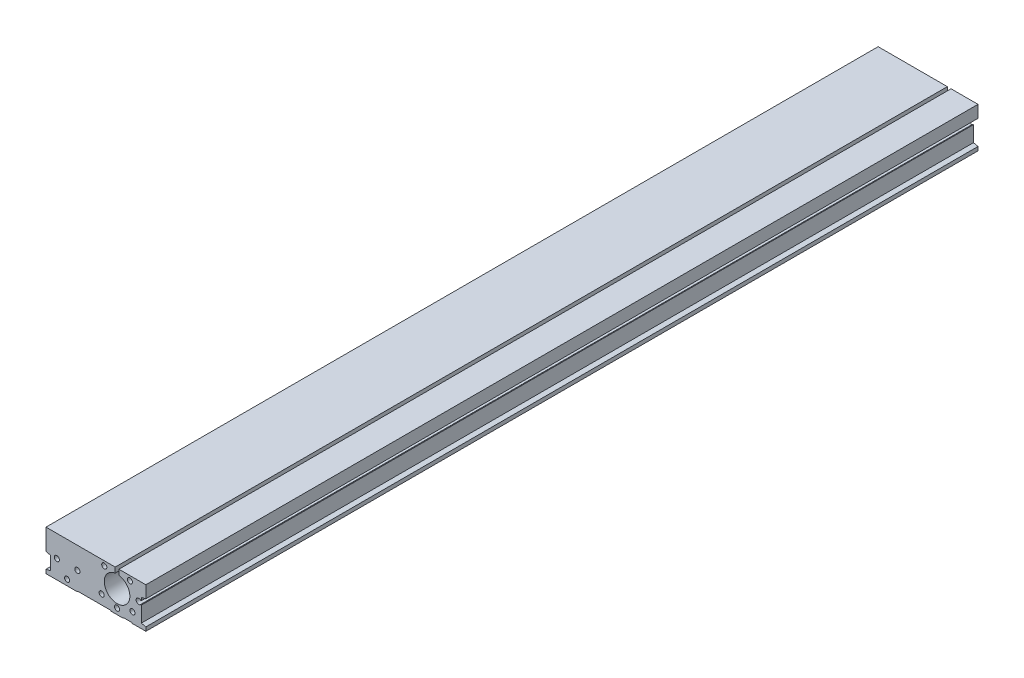
ISO-10303-21;
HEADER;
FILE_DESCRIPTION(('STEP AP214'),'2;1');
FILE_NAME('part.step','',(''),(''),'','','');
FILE_SCHEMA(('AUTOMOTIVE_DESIGN { 1 0 10303 214 1 1 1 1 }'));
ENDSEC;
DATA;
#1=APPLICATION_CONTEXT('core data for automotive mechanical design processes');
#2=APPLICATION_PROTOCOL_DEFINITION('international standard','automotive_design',2000,#1);
#3=PRODUCT_CONTEXT('',#1,'mechanical');
#4=PRODUCT('Part','Part','',(#3));
#5=PRODUCT_RELATED_PRODUCT_CATEGORY('part','',(#4));
#6=PRODUCT_DEFINITION_FORMATION('','',#4);
#7=PRODUCT_DEFINITION_CONTEXT('part definition',#1,'design');
#8=PRODUCT_DEFINITION('design','',#6,#7);
#9=PRODUCT_DEFINITION_SHAPE('','',#8);
#10=(LENGTH_UNIT() NAMED_UNIT(*) SI_UNIT(.MILLI.,.METRE.));
#11=(NAMED_UNIT(*) PLANE_ANGLE_UNIT() SI_UNIT($,.RADIAN.));
#12=(NAMED_UNIT(*) SI_UNIT($,.STERADIAN.) SOLID_ANGLE_UNIT());
#13=UNCERTAINTY_MEASURE_WITH_UNIT(LENGTH_MEASURE(1.E-05),#10,'distance_accuracy_value','');
#14=(GEOMETRIC_REPRESENTATION_CONTEXT(3) GLOBAL_UNCERTAINTY_ASSIGNED_CONTEXT((#13)) GLOBAL_UNIT_ASSIGNED_CONTEXT((#10,
#11,#12)) REPRESENTATION_CONTEXT('',''));
#15=CARTESIAN_POINT('',(0.,0.,0.));
#16=DIRECTION('',(0.,0.,1.));
#17=DIRECTION('',(1.,0.,0.));
#18=AXIS2_PLACEMENT_3D('',#15,#16,#17);
#19=CARTESIAN_POINT('',(-55.5,14.,409.12044935686));
#20=DIRECTION('',(1.,0.,0.));
#21=DIRECTION('',(0.,1.,0.));
#22=AXIS2_PLACEMENT_3D('',#19,#20,#21);
#23=PLANE('',#22);
#24=DIRECTION('',(0.,1.,0.));
#25=VECTOR('',#24,1.);
#26=CARTESIAN_POINT('',(-55.5,14.,-325.));
#27=LINE('',#26,#25);
#28=CARTESIAN_POINT('',(-55.5,-2.50000000000001,-325.));
#29=VERTEX_POINT('',#28);
#30=CARTESIAN_POINT('',(-55.5,14.,-325.));
#31=VERTEX_POINT('',#30);
#32=EDGE_CURVE('E346',#29,#31,#27,.T.);
#33=ORIENTED_EDGE('',*,*,#32,.F.);
#34=DIRECTION('',(0.,0.,1.));
#35=VECTOR('',#34,1.);
#36=CARTESIAN_POINT('',(-55.5,-2.50000000000001,-325.));
#37=LINE('',#36,#35);
#38=CARTESIAN_POINT('',(-55.5,-2.50000000000001,325.));
#39=VERTEX_POINT('',#38);
#40=EDGE_CURVE('E463',#29,#39,#37,.T.);
#41=ORIENTED_EDGE('',*,*,#40,.T.);
#42=DIRECTION('',(0.,-1.,0.));
#43=VECTOR('',#42,1.);
#44=CARTESIAN_POINT('',(-55.5,14.,325.));
#45=LINE('',#44,#43);
#46=CARTESIAN_POINT('',(-55.5,14.,325.));
#47=VERTEX_POINT('',#46);
#48=EDGE_CURVE('E286',#47,#39,#45,.T.);
#49=ORIENTED_EDGE('',*,*,#48,.F.);
#50=DIRECTION('',(0.,0.,-1.));
#51=VECTOR('',#50,1.);
#52=CARTESIAN_POINT('',(-55.5,14.,409.12044935686));
#53=LINE('',#52,#51);
#54=EDGE_CURVE('E260',#47,#31,#53,.T.);
#55=ORIENTED_EDGE('',*,*,#54,.T.);
#56=EDGE_LOOP('',(#33,#41,#49,#55));
#57=FACE_BOUND('',#56,.T.);
#58=ADVANCED_FACE('F36',(#57),#23,.F.);
#59=CARTESIAN_POINT('',(22.5,14.,409.12044935686));
#60=DIRECTION('',(-1.,0.,0.));
#61=DIRECTION('',(0.,-1.,0.));
#62=AXIS2_PLACEMENT_3D('',#59,#60,#61);
#63=PLANE('',#62);
#64=DIRECTION('',(0.,1.,0.));
#65=VECTOR('',#64,1.);
#66=CARTESIAN_POINT('',(22.5,14.,325.));
#67=LINE('',#66,#65);
#68=CARTESIAN_POINT('',(22.5,4.49999999999999,325.));
#69=VERTEX_POINT('',#68);
#70=CARTESIAN_POINT('',(22.5,14.,325.));
#71=VERTEX_POINT('',#70);
#72=EDGE_CURVE('E238',#69,#71,#67,.T.);
#73=ORIENTED_EDGE('',*,*,#72,.F.);
#74=DIRECTION('',(0.,0.,1.));
#75=VECTOR('',#74,1.);
#76=CARTESIAN_POINT('',(22.5,4.49999999999999,-325.));
#77=LINE('',#76,#75);
#78=CARTESIAN_POINT('',(22.5,4.49999999999999,-325.));
#79=VERTEX_POINT('',#78);
#80=EDGE_CURVE('E220',#79,#69,#77,.T.);
#81=ORIENTED_EDGE('',*,*,#80,.F.);
#82=DIRECTION('',(0.,-1.,0.));
#83=VECTOR('',#82,1.);
#84=CARTESIAN_POINT('',(22.5,14.,-325.));
#85=LINE('',#84,#83);
#86=CARTESIAN_POINT('',(22.5,14.,-325.));
#87=VERTEX_POINT('',#86);
#88=EDGE_CURVE('E282',#87,#79,#85,.T.);
#89=ORIENTED_EDGE('',*,*,#88,.F.);
#90=DIRECTION('',(0.,0.,-1.));
#91=VECTOR('',#90,1.);
#92=CARTESIAN_POINT('',(22.5,14.,409.12044935686));
#93=LINE('',#92,#91);
#94=EDGE_CURVE('E44',#71,#87,#93,.T.);
#95=ORIENTED_EDGE('',*,*,#94,.F.);
#96=EDGE_LOOP('',(#73,#81,#89,#95));
#97=FACE_BOUND('',#96,.T.);
#98=ADVANCED_FACE('F244',(#97),#63,.F.);
#99=CARTESIAN_POINT('',(22.5,14.,409.12044935686));
#100=DIRECTION('',(0.,-1.,0.));
#101=DIRECTION('',(1.,0.,0.));
#102=AXIS2_PLACEMENT_3D('',#99,#100,#101);
#103=PLANE('',#102);
#104=DIRECTION('',(1.,0.,0.));
#105=VECTOR('',#104,1.);
#106=CARTESIAN_POINT('',(22.5,14.,-325.));
#107=LINE('',#106,#105);
#108=CARTESIAN_POINT('',(1.45,14.,-325.));
#109=VERTEX_POINT('',#108);
#110=EDGE_CURVE('E279',#109,#87,#107,.T.);
#111=ORIENTED_EDGE('',*,*,#110,.F.);
#112=DIRECTION('',(0.,0.,1.));
#113=VECTOR('',#112,1.);
#114=CARTESIAN_POINT('',(1.45,14.,-325.));
#115=LINE('',#114,#113);
#116=CARTESIAN_POINT('',(1.45,14.,325.));
#117=VERTEX_POINT('',#116);
#118=EDGE_CURVE('E375',#109,#117,#115,.T.);
#119=ORIENTED_EDGE('',*,*,#118,.T.);
#120=DIRECTION('',(-1.,0.,0.));
#121=VECTOR('',#120,1.);
#122=CARTESIAN_POINT('',(22.5,14.,325.));
#123=LINE('',#122,#121);
#124=EDGE_CURVE('E247',#71,#117,#123,.T.);
#125=ORIENTED_EDGE('',*,*,#124,.F.);
#126=ORIENTED_EDGE('',*,*,#94,.T.);
#127=EDGE_LOOP('',(#111,#119,#125,#126));
#128=FACE_BOUND('',#127,.T.);
#129=ADVANCED_FACE('F530',(#128),#103,.F.);
#130=CARTESIAN_POINT('',(22.5,-17.5,409.12044935686));
#131=DIRECTION('',(0.,1.,0.));
#132=DIRECTION('',(-1.,0.,0.));
#133=AXIS2_PLACEMENT_3D('',#130,#131,#132);
#134=PLANE('',#133);
#135=DIRECTION('',(-1.,0.,0.));
#136=VECTOR('',#135,1.);
#137=CARTESIAN_POINT('',(22.5,-17.5,-325.));
#138=LINE('',#137,#136);
#139=CARTESIAN_POINT('',(-31.5,-17.5,-325.));
#140=VERTEX_POINT('',#139);
#141=CARTESIAN_POINT('',(-55.5,-17.5,-325.));
#142=VERTEX_POINT('',#141);
#143=EDGE_CURVE('E309',#140,#142,#138,.T.);
#144=ORIENTED_EDGE('',*,*,#143,.F.);
#145=DIRECTION('',(0.,0.,1.));
#146=VECTOR('',#145,1.);
#147=CARTESIAN_POINT('',(-31.5,-17.5,-325.));
#148=LINE('',#147,#146);
#149=CARTESIAN_POINT('',(-31.5,-17.5,325.));
#150=VERTEX_POINT('',#149);
#151=EDGE_CURVE('E308',#140,#150,#148,.T.);
#152=ORIENTED_EDGE('',*,*,#151,.T.);
#153=DIRECTION('',(1.,0.,0.));
#154=VECTOR('',#153,1.);
#155=CARTESIAN_POINT('',(22.5,-17.5,325.));
#156=LINE('',#155,#154);
#157=CARTESIAN_POINT('',(-55.5,-17.5,325.));
#158=VERTEX_POINT('',#157);
#159=EDGE_CURVE('E273',#158,#150,#156,.T.);
#160=ORIENTED_EDGE('',*,*,#159,.F.);
#161=DIRECTION('',(0.,0.,-1.));
#162=VECTOR('',#161,1.);
#163=CARTESIAN_POINT('',(-55.5,-17.5,409.12044935686));
#164=LINE('',#163,#162);
#165=EDGE_CURVE('E257',#158,#142,#164,.T.);
#166=ORIENTED_EDGE('',*,*,#165,.T.);
#167=EDGE_LOOP('',(#144,#152,#160,#166));
#168=FACE_BOUND('',#167,.T.);
#169=ADVANCED_FACE('F307',(#168),#134,.F.);
#170=CARTESIAN_POINT('',(-4.5,-17.5,325.));
#171=VERTEX_POINT('',#170);
#172=CARTESIAN_POINT('',(4.5,-17.5,325.));
#173=VERTEX_POINT('',#172);
#174=EDGE_CURVE('E271',#171,#173,#156,.T.);
#175=ORIENTED_EDGE('',*,*,#174,.F.);
#176=DIRECTION('',(0.,0.,1.));
#177=VECTOR('',#176,1.);
#178=CARTESIAN_POINT('',(-4.5,-17.5,-325.));
#179=LINE('',#178,#177);
#180=CARTESIAN_POINT('',(-4.5,-17.5,-325.));
#181=VERTEX_POINT('',#180);
#182=EDGE_CURVE('E326',#181,#171,#179,.T.);
#183=ORIENTED_EDGE('',*,*,#182,.F.);
#184=CARTESIAN_POINT('',(4.5,-17.5,-325.));
#185=VERTEX_POINT('',#184);
#186=EDGE_CURVE('E355',#185,#181,#138,.T.);
#187=ORIENTED_EDGE('',*,*,#186,.F.);
#188=DIRECTION('',(0.,0.,1.));
#189=VECTOR('',#188,1.);
#190=CARTESIAN_POINT('',(4.5,-17.5,-325.));
#191=LINE('',#190,#189);
#192=EDGE_CURVE('E343',#185,#173,#191,.T.);
#193=ORIENTED_EDGE('',*,*,#192,.T.);
#194=EDGE_LOOP('',(#175,#183,#187,#193));
#195=FACE_BOUND('',#194,.T.);
#196=ADVANCED_FACE('F575',(#195),#134,.F.);
#197=CARTESIAN_POINT('',(12.,-17.5,325.));
#198=VERTEX_POINT('',#197);
#199=CARTESIAN_POINT('',(22.5,-17.5,325.));
#200=VERTEX_POINT('',#199);
#201=EDGE_CURVE('E265',#198,#200,#156,.T.);
#202=ORIENTED_EDGE('',*,*,#201,.F.);
#203=DIRECTION('',(0.,0.,1.));
#204=VECTOR('',#203,1.);
#205=CARTESIAN_POINT('',(12.,-17.5,-325.));
#206=LINE('',#205,#204);
#207=CARTESIAN_POINT('',(12.,-17.5,-325.));
#208=VERTEX_POINT('',#207);
#209=EDGE_CURVE('E342',#208,#198,#206,.T.);
#210=ORIENTED_EDGE('',*,*,#209,.F.);
#211=CARTESIAN_POINT('',(22.5,-17.5,-325.));
#212=VERTEX_POINT('',#211);
#213=EDGE_CURVE('E352',#212,#208,#138,.T.);
#214=ORIENTED_EDGE('',*,*,#213,.F.);
#215=DIRECTION('',(0.,0.,-1.));
#216=VECTOR('',#215,1.);
#217=CARTESIAN_POINT('',(22.5,-17.5,409.12044935686));
#218=LINE('',#217,#216);
#219=EDGE_CURVE('E250',#200,#212,#218,.T.);
#220=ORIENTED_EDGE('',*,*,#219,.F.);
#221=EDGE_LOOP('',(#202,#210,#214,#220));
#222=FACE_BOUND('',#221,.T.);
#223=ADVANCED_FACE('F570',(#222),#134,.F.);
#224=CARTESIAN_POINT('',(-55.5,-14.5,325.));
#225=VERTEX_POINT('',#224);
#226=EDGE_CURVE('E285',#225,#158,#45,.T.);
#227=ORIENTED_EDGE('',*,*,#226,.F.);
#228=DIRECTION('',(0.,0.,1.));
#229=VECTOR('',#228,1.);
#230=CARTESIAN_POINT('',(-55.5,-14.5,-325.));
#231=LINE('',#230,#229);
#232=CARTESIAN_POINT('',(-55.5,-14.5,-325.));
#233=VERTEX_POINT('',#232);
#234=EDGE_CURVE('E464',#233,#225,#231,.T.);
#235=ORIENTED_EDGE('',*,*,#234,.F.);
#236=EDGE_CURVE('E303',#142,#233,#27,.T.);
#237=ORIENTED_EDGE('',*,*,#236,.F.);
#238=ORIENTED_EDGE('',*,*,#165,.F.);
#239=EDGE_LOOP('',(#227,#235,#237,#238));
#240=FACE_BOUND('',#239,.T.);
#241=ADVANCED_FACE('F301',(#240),#23,.F.);
#242=CARTESIAN_POINT('',(-1.45,14.,325.));
#243=VERTEX_POINT('',#242);
#244=EDGE_CURVE('E251',#243,#47,#123,.T.);
#245=ORIENTED_EDGE('',*,*,#244,.F.);
#246=DIRECTION('',(0.,0.,1.));
#247=VECTOR('',#246,1.);
#248=CARTESIAN_POINT('',(-1.45,14.,-325.));
#249=LINE('',#248,#247);
#250=CARTESIAN_POINT('',(-1.45,14.,-325.));
#251=VERTEX_POINT('',#250);
#252=EDGE_CURVE('E376',#251,#243,#249,.T.);
#253=ORIENTED_EDGE('',*,*,#252,.F.);
#254=EDGE_CURVE('E275',#31,#251,#107,.T.);
#255=ORIENTED_EDGE('',*,*,#254,.F.);
#256=ORIENTED_EDGE('',*,*,#54,.F.);
#257=EDGE_LOOP('',(#245,#253,#255,#256));
#258=FACE_BOUND('',#257,.T.);
#259=ADVANCED_FACE('F542',(#258),#103,.F.);
#260=CARTESIAN_POINT('',(22.5,-14.5,-325.));
#261=VERTEX_POINT('',#260);
#262=EDGE_CURVE('E354',#261,#212,#85,.T.);
#263=ORIENTED_EDGE('',*,*,#262,.F.);
#264=DIRECTION('',(0.,0.,1.));
#265=VECTOR('',#264,1.);
#266=CARTESIAN_POINT('',(22.5,-14.5,-325.));
#267=LINE('',#266,#265);
#268=CARTESIAN_POINT('',(22.5,-14.5,325.));
#269=VERTEX_POINT('',#268);
#270=EDGE_CURVE('E487',#261,#269,#267,.T.);
#271=ORIENTED_EDGE('',*,*,#270,.T.);
#272=EDGE_CURVE('E246',#200,#269,#67,.T.);
#273=ORIENTED_EDGE('',*,*,#272,.F.);
#274=ORIENTED_EDGE('',*,*,#219,.T.);
#275=EDGE_LOOP('',(#263,#271,#273,#274));
#276=FACE_BOUND('',#275,.T.);
#277=ADVANCED_FACE('F38',(#276),#63,.F.);
#278=CARTESIAN_POINT('',(0.,0.,409.12044935686));
#279=DIRECTION('',(0.,0.,-1.));
#280=DIRECTION('',(-1.,0.,0.));
#281=AXIS2_PLACEMENT_3D('',#278,#279,#280);
#282=CYLINDRICAL_SURFACE('',#281,10.);
#283=DIRECTION('',(0.,0.,1.));
#284=VECTOR('',#283,1.);
#285=CARTESIAN_POINT('',(1.45,9.89431655042429,-325.));
#286=LINE('',#285,#284);
#287=CARTESIAN_POINT('',(1.45,9.89431655042429,-325.));
#288=VERTEX_POINT('',#287);
#289=CARTESIAN_POINT('',(1.45,9.89431655042429,325.));
#290=VERTEX_POINT('',#289);
#291=EDGE_CURVE('E381',#288,#290,#286,.T.);
#292=ORIENTED_EDGE('',*,*,#291,.F.);
#293=CARTESIAN_POINT('',(0.,0.,-325.));
#294=DIRECTION('',(0.,0.,1.));
#295=DIRECTION('',(1.,0.,0.));
#296=AXIS2_PLACEMENT_3D('',#293,#294,#295);
#297=CIRCLE('',#296,10.);
#298=CARTESIAN_POINT('',(-1.45,9.89431655042429,-325.));
#299=VERTEX_POINT('',#298);
#300=EDGE_CURVE('E266',#288,#299,#297,.F.);
#301=ORIENTED_EDGE('',*,*,#300,.T.);
#302=DIRECTION('',(0.,0.,1.));
#303=VECTOR('',#302,1.);
#304=CARTESIAN_POINT('',(-1.45,9.89431655042429,-325.));
#305=LINE('',#304,#303);
#306=CARTESIAN_POINT('',(-1.45,9.89431655042429,325.));
#307=VERTEX_POINT('',#306);
#308=EDGE_CURVE('E378',#299,#307,#305,.T.);
#309=ORIENTED_EDGE('',*,*,#308,.T.);
#310=CARTESIAN_POINT('',(0.,0.,325.));
#311=DIRECTION('',(0.,0.,1.));
#312=DIRECTION('',(1.,0.,0.));
#313=AXIS2_PLACEMENT_3D('',#310,#311,#312);
#314=CIRCLE('',#313,10.);
#315=EDGE_CURVE('E263',#307,#290,#314,.T.);
#316=ORIENTED_EDGE('',*,*,#315,.T.);
#317=EDGE_LOOP('',(#292,#301,#309,#316));
#318=FACE_BOUND('',#317,.T.);
#319=ADVANCED_FACE('F535',(#318),#282,.F.);
#320=CARTESIAN_POINT('',(0.,0.,325.));
#321=DIRECTION('',(0.,0.,1.));
#322=DIRECTION('',(1.,0.,0.));
#323=AXIS2_PLACEMENT_3D('',#320,#321,#322);
#324=PLANE('',#323);
#325=DIRECTION('',(0.974370064785237,-0.224951054343859,0.));
#326=VECTOR('',#325,1.);
#327=CARTESIAN_POINT('',(19.,-13.6919613310606,325.));
#328=LINE('',#327,#326);
#329=CARTESIAN_POINT('',(19.,-13.6919613310606,325.));
#330=VERTEX_POINT('',#329);
#331=EDGE_CURVE('E501',#330,#269,#328,.T.);
#332=ORIENTED_EDGE('',*,*,#331,.F.);
#333=DIRECTION('',(0.,-1.,0.));
#334=VECTOR('',#333,1.);
#335=CARTESIAN_POINT('',(19.,3.69196133106052,325.));
#336=LINE('',#335,#334);
#337=CARTESIAN_POINT('',(19.,-1.5,325.));
#338=VERTEX_POINT('',#337);
#339=EDGE_CURVE('E241',#338,#330,#336,.T.);
#340=ORIENTED_EDGE('',*,*,#339,.F.);
#341=DIRECTION('',(1.,0.,0.));
#342=VECTOR('',#341,1.);
#343=CARTESIAN_POINT('',(22.5,-1.5,325.));
#344=LINE('',#343,#342);
#345=CARTESIAN_POINT('',(18.4696938456699,-1.5,325.));
#346=VERTEX_POINT('',#345);
#347=EDGE_CURVE('E457',#346,#338,#344,.T.);
#348=ORIENTED_EDGE('',*,*,#347,.F.);
#349=CARTESIAN_POINT('',(17.,0.,325.));
#350=DIRECTION('',(0.,0.,1.));
#351=DIRECTION('',(1.,0.,0.));
#352=AXIS2_PLACEMENT_3D('',#349,#350,#351);
#353=CIRCLE('',#352,2.1);
#354=CARTESIAN_POINT('',(18.4696938456699,1.5,325.));
#355=VERTEX_POINT('',#354);
#356=EDGE_CURVE('E460',#355,#346,#353,.T.);
#357=ORIENTED_EDGE('',*,*,#356,.F.);
#358=DIRECTION('',(-1.,0.,0.));
#359=VECTOR('',#358,1.);
#360=CARTESIAN_POINT('',(22.5,1.5,325.));
#361=LINE('',#360,#359);
#362=CARTESIAN_POINT('',(19.,1.5,325.));
#363=VERTEX_POINT('',#362);
#364=EDGE_CURVE('E455',#363,#355,#361,.T.);
#365=ORIENTED_EDGE('',*,*,#364,.F.);
#366=CARTESIAN_POINT('',(19.,3.69196133106052,325.));
#367=VERTEX_POINT('',#366);
#368=EDGE_CURVE('E51',#367,#363,#336,.T.);
#369=ORIENTED_EDGE('',*,*,#368,.F.);
#370=DIRECTION('',(-0.974370064785235,-0.224951054343865,0.));
#371=VECTOR('',#370,1.);
#372=CARTESIAN_POINT('',(22.5,4.49999999999999,325.));
#373=LINE('',#372,#371);
#374=EDGE_CURVE('E223',#69,#367,#373,.T.);
#375=ORIENTED_EDGE('',*,*,#374,.F.);
#376=ORIENTED_EDGE('',*,*,#72,.T.);
#377=ORIENTED_EDGE('',*,*,#124,.T.);
#378=DIRECTION('',(0.,1.,0.));
#379=VECTOR('',#378,1.);
#380=CARTESIAN_POINT('',(1.45,9.89431655042429,325.));
#381=LINE('',#380,#379);
#382=EDGE_CURVE('E390',#290,#117,#381,.T.);
#383=ORIENTED_EDGE('',*,*,#382,.F.);
#384=ORIENTED_EDGE('',*,*,#315,.F.);
#385=DIRECTION('',(0.,-1.,0.));
#386=VECTOR('',#385,1.);
#387=CARTESIAN_POINT('',(-1.45,14.,325.));
#388=LINE('',#387,#386);
#389=EDGE_CURVE('E392',#243,#307,#388,.T.);
#390=ORIENTED_EDGE('',*,*,#389,.F.);
#391=ORIENTED_EDGE('',*,*,#244,.T.);
#392=ORIENTED_EDGE('',*,*,#48,.T.);
#393=DIRECTION('',(-0.974370064785235,0.224951054343866,0.));
#394=VECTOR('',#393,1.);
#395=CARTESIAN_POINT('',(-52.,-3.30803866893949,325.));
#396=LINE('',#395,#394);
#397=CARTESIAN_POINT('',(-52.,-3.30803866893949,325.));
#398=VERTEX_POINT('',#397);
#399=EDGE_CURVE('E480',#398,#39,#396,.T.);
#400=ORIENTED_EDGE('',*,*,#399,.F.);
#401=DIRECTION('',(0.,1.,0.));
#402=VECTOR('',#401,1.);
#403=CARTESIAN_POINT('',(-52.,-13.6919613310606,325.));
#404=LINE('',#403,#402);
#405=CARTESIAN_POINT('',(-52.,-13.6919613310606,325.));
#406=VERTEX_POINT('',#405);
#407=EDGE_CURVE('E482',#406,#398,#404,.T.);
#408=ORIENTED_EDGE('',*,*,#407,.F.);
#409=DIRECTION('',(0.974370064785237,0.224951054343858,0.));
#410=VECTOR('',#409,1.);
#411=CARTESIAN_POINT('',(-55.5,-14.5,325.));
#412=LINE('',#411,#410);
#413=EDGE_CURVE('E297',#225,#406,#412,.T.);
#414=ORIENTED_EDGE('',*,*,#413,.F.);
#415=ORIENTED_EDGE('',*,*,#226,.T.);
#416=ORIENTED_EDGE('',*,*,#159,.T.);
#417=DIRECTION('',(-0.866025403784441,-0.499999999999996,0.));
#418=VECTOR('',#417,1.);
#419=CARTESIAN_POINT('',(-30.6339745962156,-17.,325.));
#420=LINE('',#419,#418);
#421=CARTESIAN_POINT('',(-30.6339745962156,-17.,325.));
#422=VERTEX_POINT('',#421);
#423=EDGE_CURVE('E365',#422,#150,#420,.T.);
#424=ORIENTED_EDGE('',*,*,#423,.F.);
#425=DIRECTION('',(-1.,0.,0.));
#426=VECTOR('',#425,1.);
#427=CARTESIAN_POINT('',(-5.36602540378445,-17.,325.));
#428=LINE('',#427,#426);
#429=CARTESIAN_POINT('',(-5.36602540378445,-17.,325.));
#430=VERTEX_POINT('',#429);
#431=EDGE_CURVE('E369',#430,#422,#428,.T.);
#432=ORIENTED_EDGE('',*,*,#431,.F.);
#433=DIRECTION('',(-0.866025403784442,0.499999999999995,0.));
#434=VECTOR('',#433,1.);
#435=CARTESIAN_POINT('',(-4.5,-17.5,325.));
#436=LINE('',#435,#434);
#437=EDGE_CURVE('E372',#171,#430,#436,.T.);
#438=ORIENTED_EDGE('',*,*,#437,.F.);
#439=ORIENTED_EDGE('',*,*,#174,.T.);
#440=DIRECTION('',(-0.866025403784441,-0.499999999999996,0.));
#441=VECTOR('',#440,1.);
#442=CARTESIAN_POINT('',(5.36602540378445,-17.,325.));
#443=LINE('',#442,#441);
#444=CARTESIAN_POINT('',(5.36602540378445,-17.,325.));
#445=VERTEX_POINT('',#444);
#446=EDGE_CURVE('E330',#445,#173,#443,.T.);
#447=ORIENTED_EDGE('',*,*,#446,.F.);
#448=DIRECTION('',(-1.,0.,0.));
#449=VECTOR('',#448,1.);
#450=CARTESIAN_POINT('',(11.1339745962155,-17.,325.));
#451=LINE('',#450,#449);
#452=CARTESIAN_POINT('',(11.1339745962155,-17.,325.));
#453=VERTEX_POINT('',#452);
#454=EDGE_CURVE('E317',#453,#445,#451,.T.);
#455=ORIENTED_EDGE('',*,*,#454,.F.);
#456=DIRECTION('',(-0.866025403784442,0.499999999999995,0.));
#457=VECTOR('',#456,1.);
#458=CARTESIAN_POINT('',(12.,-17.5,325.));
#459=LINE('',#458,#457);
#460=EDGE_CURVE('E313',#198,#453,#459,.T.);
#461=ORIENTED_EDGE('',*,*,#460,.F.);
#462=ORIENTED_EDGE('',*,*,#201,.T.);
#463=ORIENTED_EDGE('',*,*,#272,.T.);
#464=EDGE_LOOP('',(#332,#340,#348,#357,#365,#369,#375,#376,#377,#383,#384,#390,#391,#392,#400,
#408,#414,#415,#416,#424,#432,#438,#439,#447,#455,#461,#462,#463));
#465=FACE_BOUND('',#464,.T.);
#466=CARTESIAN_POINT('',(-39.,-13.,325.));
#467=DIRECTION('',(0.,0.,1.));
#468=DIRECTION('',(1.,0.,0.));
#469=AXIS2_PLACEMENT_3D('',#466,#467,#468);
#470=CIRCLE('',#469,2.);
#471=CARTESIAN_POINT('',(-37.,-13.,325.));
#472=VERTEX_POINT('',#471);
#473=EDGE_CURVE('E423',#472,#472,#470,.T.);
#474=ORIENTED_EDGE('',*,*,#473,.F.);
#475=EDGE_LOOP('',(#474));
#476=FACE_BOUND('',#475,.T.);
#477=CARTESIAN_POINT('',(-47.,-3.00000000000001,325.));
#478=DIRECTION('',(0.,0.,1.));
#479=DIRECTION('',(1.,0.,0.));
#480=AXIS2_PLACEMENT_3D('',#477,#478,#479);
#481=CIRCLE('',#480,2.);
#482=CARTESIAN_POINT('',(-45.,-3.00000000000001,325.));
#483=VERTEX_POINT('',#482);
#484=EDGE_CURVE('E422',#483,#483,#481,.T.);
#485=ORIENTED_EDGE('',*,*,#484,.F.);
#486=EDGE_LOOP('',(#485));
#487=FACE_BOUND('',#486,.T.);
#488=CARTESIAN_POINT('',(-31.,-3.00000000000001,325.));
#489=DIRECTION('',(0.,0.,1.));
#490=DIRECTION('',(1.,0.,0.));
#491=AXIS2_PLACEMENT_3D('',#488,#489,#490);
#492=CIRCLE('',#491,2.);
#493=CARTESIAN_POINT('',(-29.,-3.00000000000001,325.));
#494=VERTEX_POINT('',#493);
#495=EDGE_CURVE('E430',#494,#494,#492,.T.);
#496=ORIENTED_EDGE('',*,*,#495,.F.);
#497=EDGE_LOOP('',(#496));
#498=FACE_BOUND('',#497,.T.);
#499=CARTESIAN_POINT('',(0.,-13.,325.));
#500=DIRECTION('',(0.,0.,1.));
#501=DIRECTION('',(1.,0.,0.));
#502=AXIS2_PLACEMENT_3D('',#499,#500,#501);
#503=CIRCLE('',#502,2.);
#504=CARTESIAN_POINT('',(2.,-13.,325.));
#505=VERTEX_POINT('',#504);
#506=EDGE_CURVE('E436',#505,#505,#503,.T.);
#507=ORIENTED_EDGE('',*,*,#506,.F.);
#508=EDGE_LOOP('',(#507));
#509=FACE_BOUND('',#508,.T.);
#510=CARTESIAN_POINT('',(-10.,10.5,325.));
#511=DIRECTION('',(0.,0.,1.));
#512=DIRECTION('',(-1.,0.,0.));
#513=AXIS2_PLACEMENT_3D('',#510,#511,#512);
#514=CIRCLE('',#513,2.);
#515=CARTESIAN_POINT('',(-12.,10.5,325.));
#516=VERTEX_POINT('',#515);
#517=EDGE_CURVE('E405',#516,#516,#514,.T.);
#518=ORIENTED_EDGE('',*,*,#517,.F.);
#519=EDGE_LOOP('',(#518));
#520=FACE_BOUND('',#519,.T.);
#521=CARTESIAN_POINT('',(10.,10.5,325.));
#522=DIRECTION('',(0.,0.,1.));
#523=DIRECTION('',(1.,0.,0.));
#524=AXIS2_PLACEMENT_3D('',#521,#522,#523);
#525=CIRCLE('',#524,2.);
#526=CARTESIAN_POINT('',(12.,10.5,325.));
#527=VERTEX_POINT('',#526);
#528=EDGE_CURVE('E404',#527,#527,#525,.T.);
#529=ORIENTED_EDGE('',*,*,#528,.F.);
#530=EDGE_LOOP('',(#529));
#531=FACE_BOUND('',#530,.T.);
#532=CARTESIAN_POINT('',(-12.,-9.50000000000001,325.));
#533=DIRECTION('',(0.,0.,1.));
#534=DIRECTION('',(1.,0.,0.));
#535=AXIS2_PLACEMENT_3D('',#532,#533,#534);
#536=CIRCLE('',#535,2.);
#537=CARTESIAN_POINT('',(-9.99999999999999,-9.50000000000001,325.));
#538=VERTEX_POINT('',#537);
#539=EDGE_CURVE('E412',#538,#538,#536,.T.);
#540=ORIENTED_EDGE('',*,*,#539,.F.);
#541=EDGE_LOOP('',(#540));
#542=FACE_BOUND('',#541,.T.);
#543=CARTESIAN_POINT('',(12.,-9.50000000000001,325.));
#544=DIRECTION('',(0.,0.,1.));
#545=DIRECTION('',(1.,0.,0.));
#546=AXIS2_PLACEMENT_3D('',#543,#544,#545);
#547=CIRCLE('',#546,2.);
#548=CARTESIAN_POINT('',(14.,-9.50000000000001,325.));
#549=VERTEX_POINT('',#548);
#550=EDGE_CURVE('E397',#549,#549,#547,.T.);
#551=ORIENTED_EDGE('',*,*,#550,.F.);
#552=EDGE_LOOP('',(#551));
#553=FACE_BOUND('',#552,.T.);
#554=ADVANCED_FACE('F235',(#465,#476,#487,#498,#509,#520,#531,#542,#553),#324,.T.);
#555=CARTESIAN_POINT('',(0.,0.,-325.));
#556=DIRECTION('',(0.,0.,1.));
#557=DIRECTION('',(1.,0.,0.));
#558=AXIS2_PLACEMENT_3D('',#555,#556,#557);
#559=PLANE('',#558);
#560=CARTESIAN_POINT('',(-39.,-13.,-325.));
#561=DIRECTION('',(0.,0.,1.));
#562=DIRECTION('',(1.,0.,0.));
#563=AXIS2_PLACEMENT_3D('',#560,#561,#562);
#564=CIRCLE('',#563,2.);
#565=CARTESIAN_POINT('',(-37.,-13.,-325.));
#566=VERTEX_POINT('',#565);
#567=EDGE_CURVE('E419',#566,#566,#564,.T.);
#568=ORIENTED_EDGE('',*,*,#567,.T.);
#569=EDGE_LOOP('',(#568));
#570=FACE_BOUND('',#569,.T.);
#571=CARTESIAN_POINT('',(-47.,-3.00000000000001,-325.));
#572=DIRECTION('',(0.,0.,1.));
#573=DIRECTION('',(1.,0.,0.));
#574=AXIS2_PLACEMENT_3D('',#571,#572,#573);
#575=CIRCLE('',#574,2.);
#576=CARTESIAN_POINT('',(-45.,-3.00000000000001,-325.));
#577=VERTEX_POINT('',#576);
#578=EDGE_CURVE('E427',#577,#577,#575,.T.);
#579=ORIENTED_EDGE('',*,*,#578,.T.);
#580=EDGE_LOOP('',(#579));
#581=FACE_BOUND('',#580,.T.);
#582=CARTESIAN_POINT('',(-31.,-3.00000000000001,-325.));
#583=DIRECTION('',(0.,0.,1.));
#584=DIRECTION('',(1.,0.,0.));
#585=AXIS2_PLACEMENT_3D('',#582,#583,#584);
#586=CIRCLE('',#585,2.);
#587=CARTESIAN_POINT('',(-29.,-3.00000000000001,-325.));
#588=VERTEX_POINT('',#587);
#589=EDGE_CURVE('E433',#588,#588,#586,.T.);
#590=ORIENTED_EDGE('',*,*,#589,.T.);
#591=EDGE_LOOP('',(#590));
#592=FACE_BOUND('',#591,.T.);
#593=CARTESIAN_POINT('',(0.,-13.,-325.));
#594=DIRECTION('',(0.,0.,1.));
#595=DIRECTION('',(1.,0.,0.));
#596=AXIS2_PLACEMENT_3D('',#593,#594,#595);
#597=CIRCLE('',#596,2.);
#598=CARTESIAN_POINT('',(2.,-13.,-325.));
#599=VERTEX_POINT('',#598);
#600=EDGE_CURVE('E408',#599,#599,#597,.T.);
#601=ORIENTED_EDGE('',*,*,#600,.T.);
#602=EDGE_LOOP('',(#601));
#603=FACE_BOUND('',#602,.T.);
#604=CARTESIAN_POINT('',(-10.,10.5,-325.));
#605=DIRECTION('',(0.,0.,1.));
#606=DIRECTION('',(-1.,0.,0.));
#607=AXIS2_PLACEMENT_3D('',#604,#605,#606);
#608=CIRCLE('',#607,2.);
#609=CARTESIAN_POINT('',(-12.,10.5,-325.));
#610=VERTEX_POINT('',#609);
#611=EDGE_CURVE('E401',#610,#610,#608,.T.);
#612=ORIENTED_EDGE('',*,*,#611,.T.);
#613=EDGE_LOOP('',(#612));
#614=FACE_BOUND('',#613,.T.);
#615=CARTESIAN_POINT('',(10.,10.5,-325.));
#616=DIRECTION('',(0.,0.,1.));
#617=DIRECTION('',(1.,0.,0.));
#618=AXIS2_PLACEMENT_3D('',#615,#616,#617);
#619=CIRCLE('',#618,2.);
#620=CARTESIAN_POINT('',(12.,10.5,-325.));
#621=VERTEX_POINT('',#620);
#622=EDGE_CURVE('E409',#621,#621,#619,.T.);
#623=ORIENTED_EDGE('',*,*,#622,.T.);
#624=EDGE_LOOP('',(#623));
#625=FACE_BOUND('',#624,.T.);
#626=CARTESIAN_POINT('',(-12.,-9.50000000000001,-325.));
#627=DIRECTION('',(0.,0.,1.));
#628=DIRECTION('',(1.,0.,0.));
#629=AXIS2_PLACEMENT_3D('',#626,#627,#628);
#630=CIRCLE('',#629,2.);
#631=CARTESIAN_POINT('',(-9.99999999999999,-9.50000000000001,-325.));
#632=VERTEX_POINT('',#631);
#633=EDGE_CURVE('E400',#632,#632,#630,.T.);
#634=ORIENTED_EDGE('',*,*,#633,.T.);
#635=EDGE_LOOP('',(#634));
#636=FACE_BOUND('',#635,.T.);
#637=CARTESIAN_POINT('',(12.,-9.50000000000001,-325.));
#638=DIRECTION('',(0.,0.,1.));
#639=DIRECTION('',(1.,0.,0.));
#640=AXIS2_PLACEMENT_3D('',#637,#638,#639);
#641=CIRCLE('',#640,2.);
#642=CARTESIAN_POINT('',(14.,-9.50000000000001,-325.));
#643=VERTEX_POINT('',#642);
#644=EDGE_CURVE('E394',#643,#643,#641,.T.);
#645=ORIENTED_EDGE('',*,*,#644,.T.);
#646=EDGE_LOOP('',(#645));
#647=FACE_BOUND('',#646,.T.);
#648=DIRECTION('',(0.,-1.,0.));
#649=VECTOR('',#648,1.);
#650=CARTESIAN_POINT('',(19.,3.69196133106052,-325.));
#651=LINE('',#650,#649);
#652=CARTESIAN_POINT('',(19.,-1.5,-325.));
#653=VERTEX_POINT('',#652);
#654=CARTESIAN_POINT('',(19.,-13.6919613310606,-325.));
#655=VERTEX_POINT('',#654);
#656=EDGE_CURVE('E59',#653,#655,#651,.T.);
#657=ORIENTED_EDGE('',*,*,#656,.T.);
#658=DIRECTION('',(0.974370064785237,-0.224951054343859,0.));
#659=VECTOR('',#658,1.);
#660=CARTESIAN_POINT('',(19.,-13.6919613310606,-325.));
#661=LINE('',#660,#659);
#662=EDGE_CURVE('E231',#655,#261,#661,.T.);
#663=ORIENTED_EDGE('',*,*,#662,.T.);
#664=ORIENTED_EDGE('',*,*,#262,.T.);
#665=ORIENTED_EDGE('',*,*,#213,.T.);
#666=DIRECTION('',(-0.866025403784442,0.499999999999995,0.));
#667=VECTOR('',#666,1.);
#668=CARTESIAN_POINT('',(12.,-17.5,-325.));
#669=LINE('',#668,#667);
#670=CARTESIAN_POINT('',(11.1339745962156,-17.,-325.));
#671=VERTEX_POINT('',#670);
#672=EDGE_CURVE('E333',#208,#671,#669,.T.);
#673=ORIENTED_EDGE('',*,*,#672,.T.);
#674=DIRECTION('',(-1.,0.,0.));
#675=VECTOR('',#674,1.);
#676=CARTESIAN_POINT('',(11.1339745962155,-17.,-325.));
#677=LINE('',#676,#675);
#678=CARTESIAN_POINT('',(5.36602540378445,-17.,-325.));
#679=VERTEX_POINT('',#678);
#680=EDGE_CURVE('E336',#671,#679,#677,.T.);
#681=ORIENTED_EDGE('',*,*,#680,.T.);
#682=DIRECTION('',(-0.866025403784441,-0.499999999999996,0.));
#683=VECTOR('',#682,1.);
#684=CARTESIAN_POINT('',(5.36602540378445,-17.,-325.));
#685=LINE('',#684,#683);
#686=EDGE_CURVE('E339',#679,#185,#685,.T.);
#687=ORIENTED_EDGE('',*,*,#686,.T.);
#688=ORIENTED_EDGE('',*,*,#186,.T.);
#689=DIRECTION('',(-0.866025403784442,0.499999999999995,0.));
#690=VECTOR('',#689,1.);
#691=CARTESIAN_POINT('',(-4.5,-17.5,-325.));
#692=LINE('',#691,#690);
#693=CARTESIAN_POINT('',(-5.36602540378445,-17.,-325.));
#694=VERTEX_POINT('',#693);
#695=EDGE_CURVE('E364',#181,#694,#692,.T.);
#696=ORIENTED_EDGE('',*,*,#695,.T.);
#697=DIRECTION('',(-1.,0.,0.));
#698=VECTOR('',#697,1.);
#699=CARTESIAN_POINT('',(-5.36602540378445,-17.,-325.));
#700=LINE('',#699,#698);
#701=CARTESIAN_POINT('',(-30.6339745962156,-17.,-325.));
#702=VERTEX_POINT('',#701);
#703=EDGE_CURVE('E363',#694,#702,#700,.T.);
#704=ORIENTED_EDGE('',*,*,#703,.T.);
#705=DIRECTION('',(-0.866025403784441,-0.499999999999996,0.));
#706=VECTOR('',#705,1.);
#707=CARTESIAN_POINT('',(-30.6339745962156,-17.,-325.));
#708=LINE('',#707,#706);
#709=EDGE_CURVE('E322',#702,#140,#708,.T.);
#710=ORIENTED_EDGE('',*,*,#709,.T.);
#711=ORIENTED_EDGE('',*,*,#143,.T.);
#712=ORIENTED_EDGE('',*,*,#236,.T.);
#713=DIRECTION('',(0.974370064785237,0.224951054343858,0.));
#714=VECTOR('',#713,1.);
#715=CARTESIAN_POINT('',(-55.5,-14.5,-325.));
#716=LINE('',#715,#714);
#717=CARTESIAN_POINT('',(-52.,-13.6919613310606,-325.));
#718=VERTEX_POINT('',#717);
#719=EDGE_CURVE('E478',#233,#718,#716,.T.);
#720=ORIENTED_EDGE('',*,*,#719,.T.);
#721=DIRECTION('',(0.,1.,0.));
#722=VECTOR('',#721,1.);
#723=CARTESIAN_POINT('',(-52.,-13.6919613310606,-325.));
#724=LINE('',#723,#722);
#725=CARTESIAN_POINT('',(-52.,-3.30803866893949,-325.));
#726=VERTEX_POINT('',#725);
#727=EDGE_CURVE('E475',#718,#726,#724,.T.);
#728=ORIENTED_EDGE('',*,*,#727,.T.);
#729=DIRECTION('',(-0.974370064785235,0.224951054343866,0.));
#730=VECTOR('',#729,1.);
#731=CARTESIAN_POINT('',(-52.,-3.30803866893949,-325.));
#732=LINE('',#731,#730);
#733=EDGE_CURVE('E467',#726,#29,#732,.T.);
#734=ORIENTED_EDGE('',*,*,#733,.T.);
#735=ORIENTED_EDGE('',*,*,#32,.T.);
#736=ORIENTED_EDGE('',*,*,#254,.T.);
#737=DIRECTION('',(0.,-1.,0.));
#738=VECTOR('',#737,1.);
#739=CARTESIAN_POINT('',(-1.45,14.,-325.));
#740=LINE('',#739,#738);
#741=EDGE_CURVE('E387',#251,#299,#740,.T.);
#742=ORIENTED_EDGE('',*,*,#741,.T.);
#743=ORIENTED_EDGE('',*,*,#300,.F.);
#744=DIRECTION('',(0.,1.,0.));
#745=VECTOR('',#744,1.);
#746=CARTESIAN_POINT('',(1.45,9.89431655042429,-325.));
#747=LINE('',#746,#745);
#748=EDGE_CURVE('E379',#288,#109,#747,.T.);
#749=ORIENTED_EDGE('',*,*,#748,.T.);
#750=ORIENTED_EDGE('',*,*,#110,.T.);
#751=ORIENTED_EDGE('',*,*,#88,.T.);
#752=DIRECTION('',(-0.974370064785235,-0.224951054343865,0.));
#753=VECTOR('',#752,1.);
#754=CARTESIAN_POINT('',(22.5,4.49999999999999,-325.));
#755=LINE('',#754,#753);
#756=CARTESIAN_POINT('',(19.,3.69196133106052,-325.));
#757=VERTEX_POINT('',#756);
#758=EDGE_CURVE('E225',#79,#757,#755,.T.);
#759=ORIENTED_EDGE('',*,*,#758,.T.);
#760=CARTESIAN_POINT('',(19.,1.5,-325.));
#761=VERTEX_POINT('',#760);
#762=EDGE_CURVE('E497',#757,#761,#651,.T.);
#763=ORIENTED_EDGE('',*,*,#762,.T.);
#764=DIRECTION('',(-1.,0.,0.));
#765=VECTOR('',#764,1.);
#766=CARTESIAN_POINT('',(22.5,1.5,-325.));
#767=LINE('',#766,#765);
#768=CARTESIAN_POINT('',(18.4696938456699,1.5,-325.));
#769=VERTEX_POINT('',#768);
#770=EDGE_CURVE('E445',#761,#769,#767,.T.);
#771=ORIENTED_EDGE('',*,*,#770,.T.);
#772=CARTESIAN_POINT('',(17.,0.,-325.));
#773=DIRECTION('',(0.,0.,1.));
#774=DIRECTION('',(1.,0.,0.));
#775=AXIS2_PLACEMENT_3D('',#772,#773,#774);
#776=CIRCLE('',#775,2.1);
#777=CARTESIAN_POINT('',(18.4696938456699,-1.5,-325.));
#778=VERTEX_POINT('',#777);
#779=EDGE_CURVE('E452',#769,#778,#776,.T.);
#780=ORIENTED_EDGE('',*,*,#779,.T.);
#781=DIRECTION('',(1.,0.,0.));
#782=VECTOR('',#781,1.);
#783=CARTESIAN_POINT('',(22.5,-1.5,-325.));
#784=LINE('',#783,#782);
#785=EDGE_CURVE('E449',#778,#653,#784,.T.);
#786=ORIENTED_EDGE('',*,*,#785,.T.);
#787=EDGE_LOOP('',(#657,#663,#664,#665,#673,#681,#687,#688,#696,#704,#710,#711,#712,#720,#728,
#734,#735,#736,#742,#743,#749,#750,#751,#759,#763,#771,#780,#786));
#788=FACE_BOUND('',#787,.T.);
#789=ADVANCED_FACE('F359',(#570,#581,#592,#603,#614,#625,#636,#647,#788),#559,.F.);
#790=CARTESIAN_POINT('',(5.36602540378445,-17.,-325.));
#791=DIRECTION('',(-0.499999999999996,0.866025403784441,0.));
#792=DIRECTION('',(-0.866025403784441,-0.499999999999996,0.));
#793=AXIS2_PLACEMENT_3D('',#790,#791,#792);
#794=PLANE('',#793);
#795=ORIENTED_EDGE('',*,*,#192,.F.);
#796=ORIENTED_EDGE('',*,*,#686,.F.);
#797=DIRECTION('',(0.,0.,1.));
#798=VECTOR('',#797,1.);
#799=CARTESIAN_POINT('',(5.36602540378445,-17.,-325.));
#800=LINE('',#799,#798);
#801=EDGE_CURVE('E347',#679,#445,#800,.T.);
#802=ORIENTED_EDGE('',*,*,#801,.T.);
#803=ORIENTED_EDGE('',*,*,#446,.T.);
#804=EDGE_LOOP('',(#795,#796,#802,#803));
#805=FACE_BOUND('',#804,.T.);
#806=ADVANCED_FACE('F626',(#805),#794,.F.);
#807=CARTESIAN_POINT('',(11.1339745962155,-17.,-325.));
#808=DIRECTION('',(0.,1.,0.));
#809=DIRECTION('',(0.,0.,1.));
#810=AXIS2_PLACEMENT_3D('',#807,#808,#809);
#811=PLANE('',#810);
#812=ORIENTED_EDGE('',*,*,#801,.F.);
#813=ORIENTED_EDGE('',*,*,#680,.F.);
#814=DIRECTION('',(0.,0.,1.));
#815=VECTOR('',#814,1.);
#816=CARTESIAN_POINT('',(11.1339745962155,-17.,-325.));
#817=LINE('',#816,#815);
#818=EDGE_CURVE('E349',#671,#453,#817,.T.);
#819=ORIENTED_EDGE('',*,*,#818,.T.);
#820=ORIENTED_EDGE('',*,*,#454,.T.);
#821=EDGE_LOOP('',(#812,#813,#819,#820));
#822=FACE_BOUND('',#821,.T.);
#823=ADVANCED_FACE('F826',(#822),#811,.F.);
#824=CARTESIAN_POINT('',(12.,-17.5,-325.));
#825=DIRECTION('',(0.499999999999995,0.866025403784442,0.));
#826=DIRECTION('',(-0.866025403784442,0.499999999999995,0.));
#827=AXIS2_PLACEMENT_3D('',#824,#825,#826);
#828=PLANE('',#827);
#829=ORIENTED_EDGE('',*,*,#818,.F.);
#830=ORIENTED_EDGE('',*,*,#672,.F.);
#831=ORIENTED_EDGE('',*,*,#209,.T.);
#832=ORIENTED_EDGE('',*,*,#460,.T.);
#833=EDGE_LOOP('',(#829,#830,#831,#832));
#834=FACE_BOUND('',#833,.T.);
#835=ADVANCED_FACE('F819',(#834),#828,.F.);
#836=CARTESIAN_POINT('',(-30.6339745962156,-17.,-325.));
#837=DIRECTION('',(-0.499999999999996,0.866025403784441,0.));
#838=DIRECTION('',(-0.866025403784441,-0.499999999999996,0.));
#839=AXIS2_PLACEMENT_3D('',#836,#837,#838);
#840=PLANE('',#839);
#841=ORIENTED_EDGE('',*,*,#151,.F.);
#842=ORIENTED_EDGE('',*,*,#709,.F.);
#843=DIRECTION('',(0.,0.,1.));
#844=VECTOR('',#843,1.);
#845=CARTESIAN_POINT('',(-30.6339745962156,-17.,-325.));
#846=LINE('',#845,#844);
#847=EDGE_CURVE('E314',#702,#422,#846,.T.);
#848=ORIENTED_EDGE('',*,*,#847,.T.);
#849=ORIENTED_EDGE('',*,*,#423,.T.);
#850=EDGE_LOOP('',(#841,#842,#848,#849));
#851=FACE_BOUND('',#850,.T.);
#852=ADVANCED_FACE('F815',(#851),#840,.F.);
#853=CARTESIAN_POINT('',(-5.36602540378445,-17.,-325.));
#854=DIRECTION('',(0.,1.,0.));
#855=DIRECTION('',(-1.,0.,0.));
#856=AXIS2_PLACEMENT_3D('',#853,#854,#855);
#857=PLANE('',#856);
#858=ORIENTED_EDGE('',*,*,#847,.F.);
#859=ORIENTED_EDGE('',*,*,#703,.F.);
#860=DIRECTION('',(0.,0.,1.));
#861=VECTOR('',#860,1.);
#862=CARTESIAN_POINT('',(-5.36602540378445,-17.,-325.));
#863=LINE('',#862,#861);
#864=EDGE_CURVE('E319',#694,#430,#863,.T.);
#865=ORIENTED_EDGE('',*,*,#864,.T.);
#866=ORIENTED_EDGE('',*,*,#431,.T.);
#867=EDGE_LOOP('',(#858,#859,#865,#866));
#868=FACE_BOUND('',#867,.T.);
#869=ADVANCED_FACE('F818',(#868),#857,.F.);
#870=CARTESIAN_POINT('',(-4.5,-17.5,-325.));
#871=DIRECTION('',(0.499999999999995,0.866025403784442,0.));
#872=DIRECTION('',(-0.866025403784442,0.499999999999995,0.));
#873=AXIS2_PLACEMENT_3D('',#870,#871,#872);
#874=PLANE('',#873);
#875=ORIENTED_EDGE('',*,*,#864,.F.);
#876=ORIENTED_EDGE('',*,*,#695,.F.);
#877=ORIENTED_EDGE('',*,*,#182,.T.);
#878=ORIENTED_EDGE('',*,*,#437,.T.);
#879=EDGE_LOOP('',(#875,#876,#877,#878));
#880=FACE_BOUND('',#879,.T.);
#881=ADVANCED_FACE('F721',(#880),#874,.F.);
#882=CARTESIAN_POINT('',(-1.45,14.,-325.));
#883=DIRECTION('',(-1.,0.,0.));
#884=DIRECTION('',(0.,-1.,0.));
#885=AXIS2_PLACEMENT_3D('',#882,#883,#884);
#886=PLANE('',#885);
#887=ORIENTED_EDGE('',*,*,#308,.F.);
#888=ORIENTED_EDGE('',*,*,#741,.F.);
#889=ORIENTED_EDGE('',*,*,#252,.T.);
#890=ORIENTED_EDGE('',*,*,#389,.T.);
#891=EDGE_LOOP('',(#887,#888,#889,#890));
#892=FACE_BOUND('',#891,.T.);
#893=ADVANCED_FACE('F539',(#892),#886,.F.);
#894=CARTESIAN_POINT('',(1.45,9.89431655042429,-325.));
#895=DIRECTION('',(1.,0.,0.));
#896=DIRECTION('',(0.,1.,0.));
#897=AXIS2_PLACEMENT_3D('',#894,#895,#896);
#898=PLANE('',#897);
#899=ORIENTED_EDGE('',*,*,#118,.F.);
#900=ORIENTED_EDGE('',*,*,#748,.F.);
#901=ORIENTED_EDGE('',*,*,#291,.T.);
#902=ORIENTED_EDGE('',*,*,#382,.T.);
#903=EDGE_LOOP('',(#899,#900,#901,#902));
#904=FACE_BOUND('',#903,.T.);
#905=ADVANCED_FACE('F534',(#904),#898,.F.);
#906=CARTESIAN_POINT('',(12.,-9.50000000000001,-325.));
#907=DIRECTION('',(0.,0.,1.));
#908=DIRECTION('',(1.,0.,0.));
#909=AXIS2_PLACEMENT_3D('',#906,#907,#908);
#910=CYLINDRICAL_SURFACE('',#909,2.);
#911=ORIENTED_EDGE('',*,*,#644,.F.);
#912=EDGE_LOOP('',(#911));
#913=FACE_BOUND('',#912,.T.);
#914=ORIENTED_EDGE('',*,*,#550,.T.);
#915=EDGE_LOOP('',(#914));
#916=FACE_BOUND('',#915,.T.);
#917=ADVANCED_FACE('F731',(#913,#916),#910,.F.);
#918=CARTESIAN_POINT('',(-12.,-9.50000000000001,-325.));
#919=DIRECTION('',(0.,0.,1.));
#920=DIRECTION('',(1.,0.,0.));
#921=AXIS2_PLACEMENT_3D('',#918,#919,#920);
#922=CYLINDRICAL_SURFACE('',#921,2.);
#923=ORIENTED_EDGE('',*,*,#633,.F.);
#924=EDGE_LOOP('',(#923));
#925=FACE_BOUND('',#924,.T.);
#926=ORIENTED_EDGE('',*,*,#539,.T.);
#927=EDGE_LOOP('',(#926));
#928=FACE_BOUND('',#927,.T.);
#929=ADVANCED_FACE('F740',(#925,#928),#922,.F.);
#930=CARTESIAN_POINT('',(10.,10.5,-325.));
#931=DIRECTION('',(0.,0.,1.));
#932=DIRECTION('',(1.,0.,0.));
#933=AXIS2_PLACEMENT_3D('',#930,#931,#932);
#934=CYLINDRICAL_SURFACE('',#933,2.);
#935=ORIENTED_EDGE('',*,*,#622,.F.);
#936=EDGE_LOOP('',(#935));
#937=FACE_BOUND('',#936,.T.);
#938=ORIENTED_EDGE('',*,*,#528,.T.);
#939=EDGE_LOOP('',(#938));
#940=FACE_BOUND('',#939,.T.);
#941=ADVANCED_FACE('F750',(#937,#940),#934,.F.);
#942=CARTESIAN_POINT('',(-10.,10.5,-325.));
#943=DIRECTION('',(0.,0.,1.));
#944=DIRECTION('',(1.,0.,0.));
#945=AXIS2_PLACEMENT_3D('',#942,#943,#944);
#946=CYLINDRICAL_SURFACE('',#945,2.);
#947=ORIENTED_EDGE('',*,*,#611,.F.);
#948=EDGE_LOOP('',(#947));
#949=FACE_BOUND('',#948,.T.);
#950=ORIENTED_EDGE('',*,*,#517,.T.);
#951=EDGE_LOOP('',(#950));
#952=FACE_BOUND('',#951,.T.);
#953=ADVANCED_FACE('F760',(#949,#952),#946,.F.);
#954=CARTESIAN_POINT('',(0.,-13.,-325.));
#955=DIRECTION('',(0.,0.,1.));
#956=DIRECTION('',(1.,0.,0.));
#957=AXIS2_PLACEMENT_3D('',#954,#955,#956);
#958=CYLINDRICAL_SURFACE('',#957,2.);
#959=ORIENTED_EDGE('',*,*,#600,.F.);
#960=EDGE_LOOP('',(#959));
#961=FACE_BOUND('',#960,.T.);
#962=ORIENTED_EDGE('',*,*,#506,.T.);
#963=EDGE_LOOP('',(#962));
#964=FACE_BOUND('',#963,.T.);
#965=ADVANCED_FACE('F770',(#961,#964),#958,.F.);
#966=CARTESIAN_POINT('',(-31.,-3.00000000000001,-325.));
#967=DIRECTION('',(0.,0.,1.));
#968=DIRECTION('',(1.,0.,0.));
#969=AXIS2_PLACEMENT_3D('',#966,#967,#968);
#970=CYLINDRICAL_SURFACE('',#969,2.);
#971=ORIENTED_EDGE('',*,*,#589,.F.);
#972=EDGE_LOOP('',(#971));
#973=FACE_BOUND('',#972,.T.);
#974=ORIENTED_EDGE('',*,*,#495,.T.);
#975=EDGE_LOOP('',(#974));
#976=FACE_BOUND('',#975,.T.);
#977=ADVANCED_FACE('F780',(#973,#976),#970,.F.);
#978=CARTESIAN_POINT('',(-47.,-3.00000000000001,-325.));
#979=DIRECTION('',(0.,0.,1.));
#980=DIRECTION('',(1.,0.,0.));
#981=AXIS2_PLACEMENT_3D('',#978,#979,#980);
#982=CYLINDRICAL_SURFACE('',#981,2.);
#983=ORIENTED_EDGE('',*,*,#578,.F.);
#984=EDGE_LOOP('',(#983));
#985=FACE_BOUND('',#984,.T.);
#986=ORIENTED_EDGE('',*,*,#484,.T.);
#987=EDGE_LOOP('',(#986));
#988=FACE_BOUND('',#987,.T.);
#989=ADVANCED_FACE('F790',(#985,#988),#982,.F.);
#990=CARTESIAN_POINT('',(-39.,-13.,-325.));
#991=DIRECTION('',(0.,0.,1.));
#992=DIRECTION('',(1.,0.,0.));
#993=AXIS2_PLACEMENT_3D('',#990,#991,#992);
#994=CYLINDRICAL_SURFACE('',#993,2.);
#995=ORIENTED_EDGE('',*,*,#567,.F.);
#996=EDGE_LOOP('',(#995));
#997=FACE_BOUND('',#996,.T.);
#998=ORIENTED_EDGE('',*,*,#473,.T.);
#999=EDGE_LOOP('',(#998));
#1000=FACE_BOUND('',#999,.T.);
#1001=ADVANCED_FACE('F799',(#997,#1000),#994,.F.);
#1002=CARTESIAN_POINT('',(17.,0.,-325.));
#1003=DIRECTION('',(0.,0.,1.));
#1004=DIRECTION('',(1.,0.,0.));
#1005=AXIS2_PLACEMENT_3D('',#1002,#1003,#1004);
#1006=CYLINDRICAL_SURFACE('',#1005,2.1);
#1007=DIRECTION('',(0.,0.,1.));
#1008=VECTOR('',#1007,1.);
#1009=CARTESIAN_POINT('',(18.4696938456699,-1.5,-325.));
#1010=LINE('',#1009,#1008);
#1011=EDGE_CURVE('E443',#778,#346,#1010,.T.);
#1012=ORIENTED_EDGE('',*,*,#1011,.F.);
#1013=ORIENTED_EDGE('',*,*,#779,.F.);
#1014=DIRECTION('',(0.,0.,1.));
#1015=VECTOR('',#1014,1.);
#1016=CARTESIAN_POINT('',(18.4696938456699,1.5,-325.));
#1017=LINE('',#1016,#1015);
#1018=EDGE_CURVE('E426',#769,#355,#1017,.T.);
#1019=ORIENTED_EDGE('',*,*,#1018,.T.);
#1020=ORIENTED_EDGE('',*,*,#356,.T.);
#1021=EDGE_LOOP('',(#1012,#1013,#1019,#1020));
#1022=FACE_BOUND('',#1021,.T.);
#1023=ADVANCED_FACE('F521',(#1022),#1006,.F.);
#1024=CARTESIAN_POINT('',(22.5,1.5,-325.));
#1025=DIRECTION('',(0.,1.,0.));
#1026=DIRECTION('',(-1.,0.,0.));
#1027=AXIS2_PLACEMENT_3D('',#1024,#1025,#1026);
#1028=PLANE('',#1027);
#1029=ORIENTED_EDGE('',*,*,#770,.F.);
#1030=DIRECTION('',(0.,0.,1.));
#1031=VECTOR('',#1030,1.);
#1032=CARTESIAN_POINT('',(19.,1.5,-325.));
#1033=LINE('',#1032,#1031);
#1034=EDGE_CURVE('E486',#761,#363,#1033,.T.);
#1035=ORIENTED_EDGE('',*,*,#1034,.T.);
#1036=ORIENTED_EDGE('',*,*,#364,.T.);
#1037=ORIENTED_EDGE('',*,*,#1018,.F.);
#1038=EDGE_LOOP('',(#1029,#1035,#1036,#1037));
#1039=FACE_BOUND('',#1038,.T.);
#1040=ADVANCED_FACE('F525',(#1039),#1028,.F.);
#1041=CARTESIAN_POINT('',(22.5,-1.5,-325.));
#1042=DIRECTION('',(0.,-1.,0.));
#1043=DIRECTION('',(1.,0.,0.));
#1044=AXIS2_PLACEMENT_3D('',#1041,#1042,#1043);
#1045=PLANE('',#1044);
#1046=ORIENTED_EDGE('',*,*,#347,.T.);
#1047=DIRECTION('',(0.,0.,-1.));
#1048=VECTOR('',#1047,1.);
#1049=CARTESIAN_POINT('',(19.,-1.5,-325.));
#1050=LINE('',#1049,#1048);
#1051=EDGE_CURVE('E11',#338,#653,#1050,.T.);
#1052=ORIENTED_EDGE('',*,*,#1051,.T.);
#1053=ORIENTED_EDGE('',*,*,#785,.F.);
#1054=ORIENTED_EDGE('',*,*,#1011,.T.);
#1055=EDGE_LOOP('',(#1046,#1052,#1053,#1054));
#1056=FACE_BOUND('',#1055,.T.);
#1057=ADVANCED_FACE('F518',(#1056),#1045,.F.);
#1058=CARTESIAN_POINT('',(-52.,-3.30803866893949,-325.));
#1059=DIRECTION('',(0.224951054343866,0.974370064785235,0.));
#1060=DIRECTION('',(-0.974370064785235,0.224951054343866,0.));
#1061=AXIS2_PLACEMENT_3D('',#1058,#1059,#1060);
#1062=PLANE('',#1061);
#1063=ORIENTED_EDGE('',*,*,#40,.F.);
#1064=ORIENTED_EDGE('',*,*,#733,.F.);
#1065=DIRECTION('',(0.,0.,1.));
#1066=VECTOR('',#1065,1.);
#1067=CARTESIAN_POINT('',(-52.,-3.30803866893949,-325.));
#1068=LINE('',#1067,#1066);
#1069=EDGE_CURVE('E469',#726,#398,#1068,.T.);
#1070=ORIENTED_EDGE('',*,*,#1069,.T.);
#1071=ORIENTED_EDGE('',*,*,#399,.T.);
#1072=EDGE_LOOP('',(#1063,#1064,#1070,#1071));
#1073=FACE_BOUND('',#1072,.T.);
#1074=ADVANCED_FACE('F548',(#1073),#1062,.F.);
#1075=CARTESIAN_POINT('',(-52.,-13.6919613310606,-325.));
#1076=DIRECTION('',(1.,0.,0.));
#1077=DIRECTION('',(0.,0.,-1.));
#1078=AXIS2_PLACEMENT_3D('',#1075,#1076,#1077);
#1079=PLANE('',#1078);
#1080=ORIENTED_EDGE('',*,*,#1069,.F.);
#1081=ORIENTED_EDGE('',*,*,#727,.F.);
#1082=DIRECTION('',(0.,0.,1.));
#1083=VECTOR('',#1082,1.);
#1084=CARTESIAN_POINT('',(-52.,-13.6919613310606,-325.));
#1085=LINE('',#1084,#1083);
#1086=EDGE_CURVE('E466',#718,#406,#1085,.T.);
#1087=ORIENTED_EDGE('',*,*,#1086,.T.);
#1088=ORIENTED_EDGE('',*,*,#407,.T.);
#1089=EDGE_LOOP('',(#1080,#1081,#1087,#1088));
#1090=FACE_BOUND('',#1089,.T.);
#1091=ADVANCED_FACE('F551',(#1090),#1079,.F.);
#1092=CARTESIAN_POINT('',(-55.5,-14.5,-325.));
#1093=DIRECTION('',(0.224951054343858,-0.974370064785237,0.));
#1094=DIRECTION('',(0.974370064785237,0.224951054343858,0.));
#1095=AXIS2_PLACEMENT_3D('',#1092,#1093,#1094);
#1096=PLANE('',#1095);
#1097=ORIENTED_EDGE('',*,*,#1086,.F.);
#1098=ORIENTED_EDGE('',*,*,#719,.F.);
#1099=ORIENTED_EDGE('',*,*,#234,.T.);
#1100=ORIENTED_EDGE('',*,*,#413,.T.);
#1101=EDGE_LOOP('',(#1097,#1098,#1099,#1100));
#1102=FACE_BOUND('',#1101,.T.);
#1103=ADVANCED_FACE('F553',(#1102),#1096,.F.);
#1104=CARTESIAN_POINT('',(19.,3.69196133106052,-325.));
#1105=DIRECTION('',(-1.,0.,0.));
#1106=DIRECTION('',(0.,0.,1.));
#1107=AXIS2_PLACEMENT_3D('',#1104,#1105,#1106);
#1108=PLANE('',#1107);
#1109=ORIENTED_EDGE('',*,*,#339,.T.);
#1110=DIRECTION('',(0.,0.,1.));
#1111=VECTOR('',#1110,1.);
#1112=CARTESIAN_POINT('',(19.,-13.6919613310606,-325.));
#1113=LINE('',#1112,#1111);
#1114=EDGE_CURVE('E490',#655,#330,#1113,.T.);
#1115=ORIENTED_EDGE('',*,*,#1114,.F.);
#1116=ORIENTED_EDGE('',*,*,#656,.F.);
#1117=ORIENTED_EDGE('',*,*,#1051,.F.);
#1118=EDGE_LOOP('',(#1109,#1115,#1116,#1117));
#1119=FACE_BOUND('',#1118,.T.);
#1120=ADVANCED_FACE('F504',(#1119),#1108,.F.);
#1121=CARTESIAN_POINT('',(19.,-13.6919613310606,-325.));
#1122=DIRECTION('',(-0.224951054343859,-0.974370064785237,0.));
#1123=DIRECTION('',(0.974370064785237,-0.224951054343859,0.));
#1124=AXIS2_PLACEMENT_3D('',#1121,#1122,#1123);
#1125=PLANE('',#1124);
#1126=ORIENTED_EDGE('',*,*,#270,.F.);
#1127=ORIENTED_EDGE('',*,*,#662,.F.);
#1128=ORIENTED_EDGE('',*,*,#1114,.T.);
#1129=ORIENTED_EDGE('',*,*,#331,.T.);
#1130=EDGE_LOOP('',(#1126,#1127,#1128,#1129));
#1131=FACE_BOUND('',#1130,.T.);
#1132=ADVANCED_FACE('F508',(#1131),#1125,.F.);
#1133=ORIENTED_EDGE('',*,*,#762,.F.);
#1134=DIRECTION('',(0.,0.,1.));
#1135=VECTOR('',#1134,1.);
#1136=CARTESIAN_POINT('',(19.,3.69196133106052,-325.));
#1137=LINE('',#1136,#1135);
#1138=EDGE_CURVE('E230',#757,#367,#1137,.T.);
#1139=ORIENTED_EDGE('',*,*,#1138,.T.);
#1140=ORIENTED_EDGE('',*,*,#368,.T.);
#1141=ORIENTED_EDGE('',*,*,#1034,.F.);
#1142=EDGE_LOOP('',(#1133,#1139,#1140,#1141));
#1143=FACE_BOUND('',#1142,.T.);
#1144=ADVANCED_FACE('F527',(#1143),#1108,.F.);
#1145=CARTESIAN_POINT('',(22.5,4.49999999999999,-325.));
#1146=DIRECTION('',(-0.224951054343865,0.974370064785235,0.));
#1147=DIRECTION('',(-0.974370064785235,-0.224951054343865,0.));
#1148=AXIS2_PLACEMENT_3D('',#1145,#1146,#1147);
#1149=PLANE('',#1148);
#1150=ORIENTED_EDGE('',*,*,#1138,.F.);
#1151=ORIENTED_EDGE('',*,*,#758,.F.);
#1152=ORIENTED_EDGE('',*,*,#80,.T.);
#1153=ORIENTED_EDGE('',*,*,#374,.T.);
#1154=EDGE_LOOP('',(#1150,#1151,#1152,#1153));
#1155=FACE_BOUND('',#1154,.T.);
#1156=ADVANCED_FACE('F222',(#1155),#1149,.F.);
#1157=CLOSED_SHELL('',(#58,#98,#129,#169,#196,#223,#241,#259,#277,#319,#554,#789,#806,#823,#835,
#852,#869,#881,#893,#905,#917,#929,#941,#953,#965,#977,#989,#1001,#1023,#1040,#1057,#1074,#1091,
#1103,#1120,#1132,#1144,#1156));
#1158=MANIFOLD_SOLID_BREP('B2',#1157);
#1159=ADVANCED_BREP_SHAPE_REPRESENTATION('',(#18,#1158),#14);
#1160=SHAPE_DEFINITION_REPRESENTATION(#9,#1159);
ENDSEC;
END-ISO-10303-21;
